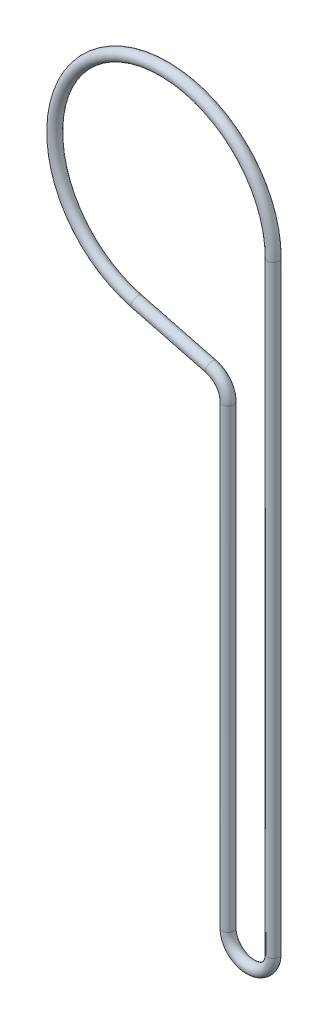
ISO-10303-21;
HEADER;
FILE_DESCRIPTION(('STEP AP214'),'2;1');
FILE_NAME('part.step','',(''),(''),'','','');
FILE_SCHEMA(('AUTOMOTIVE_DESIGN { 1 0 10303 214 1 1 1 1 }'));
ENDSEC;
DATA;
#1=APPLICATION_CONTEXT('core data for automotive mechanical design processes');
#2=APPLICATION_PROTOCOL_DEFINITION('international standard','automotive_design',2000,#1);
#3=PRODUCT_CONTEXT('',#1,'mechanical');
#4=PRODUCT('Part','Part','',(#3));
#5=PRODUCT_RELATED_PRODUCT_CATEGORY('part','',(#4));
#6=PRODUCT_DEFINITION_FORMATION('','',#4);
#7=PRODUCT_DEFINITION_CONTEXT('part definition',#1,'design');
#8=PRODUCT_DEFINITION('design','',#6,#7);
#9=PRODUCT_DEFINITION_SHAPE('','',#8);
#10=(LENGTH_UNIT() NAMED_UNIT(*) SI_UNIT(.MILLI.,.METRE.));
#11=(NAMED_UNIT(*) PLANE_ANGLE_UNIT() SI_UNIT($,.RADIAN.));
#12=(NAMED_UNIT(*) SI_UNIT($,.STERADIAN.) SOLID_ANGLE_UNIT());
#13=UNCERTAINTY_MEASURE_WITH_UNIT(LENGTH_MEASURE(1.E-05),#10,'distance_accuracy_value','');
#14=(GEOMETRIC_REPRESENTATION_CONTEXT(3) GLOBAL_UNCERTAINTY_ASSIGNED_CONTEXT((#13)) GLOBAL_UNIT_ASSIGNED_CONTEXT((#10,
#11,#12)) REPRESENTATION_CONTEXT('',''));
#15=CARTESIAN_POINT('',(0.,0.,0.));
#16=DIRECTION('',(0.,0.,1.));
#17=DIRECTION('',(1.,0.,0.));
#18=AXIS2_PLACEMENT_3D('',#15,#16,#17);
#19=CARTESIAN_POINT('',(23.,-160.,0.));
#20=DIRECTION('',(0.,0.,-1.));
#21=DIRECTION('',(-1.,0.,0.));
#22=AXIS2_PLACEMENT_3D('',#19,#20,#21);
#23=TOROIDAL_SURFACE('',#22,6.,1.5);
#24=CARTESIAN_POINT('',(29.,-160.,0.));
#25=DIRECTION('',(0.,1.,0.));
#26=DIRECTION('',(-1.,0.,0.));
#27=AXIS2_PLACEMENT_3D('',#24,#25,#26);
#28=CIRCLE('',#27,1.5);
#29=CARTESIAN_POINT('',(30.5,-160.,0.));
#30=VERTEX_POINT('',#29);
#31=EDGE_CURVE('E65',#30,#30,#28,.T.);
#32=CARTESIAN_POINT('',(17.,-160.,0.));
#33=DIRECTION('',(0.,-1.,0.));
#34=DIRECTION('',(1.,0.,0.));
#35=AXIS2_PLACEMENT_3D('',#32,#33,#34);
#36=CIRCLE('',#35,1.5);
#37=CARTESIAN_POINT('',(15.5,-160.,0.));
#38=VERTEX_POINT('',#37);
#39=EDGE_CURVE('E62',#38,#38,#36,.T.);
#40=CARTESIAN_POINT('',(23.,-160.,0.));
#41=DIRECTION('',(0.,0.,-1.));
#42=DIRECTION('',(-1.,0.,0.));
#43=AXIS2_PLACEMENT_3D('',#40,#41,#42);
#44=CIRCLE('',#43,7.5);
#45=EDGE_CURVE('',#30,#38,#44,.T.);
#46=ORIENTED_EDGE('',*,*,#31,.F.);
#47=ORIENTED_EDGE('',*,*,#39,.T.);
#48=ORIENTED_EDGE('',*,*,#45,.T.);
#49=ORIENTED_EDGE('',*,*,#45,.F.);
#50=EDGE_LOOP('',(#46,#48,#47,#49));
#51=FACE_BOUND('',#50,.T.);
#52=ADVANCED_FACE('F42',(#51),#23,.T.);
#53=CARTESIAN_POINT('',(17.,-160.,0.));
#54=DIRECTION('',(0.,1.,0.));
#55=DIRECTION('',(-1.,0.,0.));
#56=AXIS2_PLACEMENT_3D('',#53,#54,#55);
#57=CYLINDRICAL_SURFACE('',#56,1.5);
#58=CARTESIAN_POINT('',(17.,-39.,0.));
#59=DIRECTION('',(0.,-1.,0.));
#60=DIRECTION('',(1.,0.,0.));
#61=AXIS2_PLACEMENT_3D('',#58,#59,#60);
#62=CIRCLE('',#61,1.5);
#63=CARTESIAN_POINT('',(18.5,-39.,0.));
#64=VERTEX_POINT('',#63);
#65=EDGE_CURVE('E57',#64,#64,#62,.T.);
#66=ORIENTED_EDGE('',*,*,#65,.T.);
#67=EDGE_LOOP('',(#66));
#68=FACE_BOUND('',#67,.T.);
#69=ORIENTED_EDGE('',*,*,#39,.F.);
#70=EDGE_LOOP('',(#69));
#71=FACE_BOUND('',#70,.T.);
#72=ADVANCED_FACE('F72',(#68,#71),#57,.T.);
#73=CARTESIAN_POINT('',(11.,-39.,0.));
#74=DIRECTION('',(0.,0.,1.));
#75=DIRECTION('',(1.,0.,0.));
#76=AXIS2_PLACEMENT_3D('',#73,#74,#75);
#77=TOROIDAL_SURFACE('',#76,6.,1.5);
#78=CARTESIAN_POINT('',(12.5032979405962,-33.1913775039344,0.));
#79=DIRECTION('',(0.968103749344265,-0.250549656766033,0.));
#80=DIRECTION('',(0.250549656766033,0.968103749344265,0.));
#81=AXIS2_PLACEMENT_3D('',#78,#79,#80);
#82=CIRCLE('',#81,1.5);
#83=CARTESIAN_POINT('',(12.8791224257453,-31.739221879918,0.));
#84=VERTEX_POINT('',#83);
#85=EDGE_CURVE('E53',#84,#84,#82,.T.);
#86=CARTESIAN_POINT('',(11.,-39.,0.));
#87=DIRECTION('',(0.,0.,1.));
#88=DIRECTION('',(1.,0.,0.));
#89=AXIS2_PLACEMENT_3D('',#86,#87,#88);
#90=CIRCLE('',#89,7.5);
#91=EDGE_CURVE('',#64,#84,#90,.T.);
#92=ORIENTED_EDGE('',*,*,#65,.F.);
#93=ORIENTED_EDGE('',*,*,#85,.T.);
#94=ORIENTED_EDGE('',*,*,#91,.T.);
#95=ORIENTED_EDGE('',*,*,#91,.F.);
#96=EDGE_LOOP('',(#92,#94,#93,#95));
#97=FACE_BOUND('',#96,.T.);
#98=ADVANCED_FACE('F78',(#97),#77,.T.);
#99=CARTESIAN_POINT('',(12.5032979405962,-33.1913775039344,0.));
#100=DIRECTION('',(-0.968103749344265,0.250549656766031,0.));
#101=DIRECTION('',(-0.250549656766031,-0.968103749344265,0.));
#102=AXIS2_PLACEMENT_3D('',#99,#100,#101);
#103=CYLINDRICAL_SURFACE('',#102,1.5);
#104=CARTESIAN_POINT('',(-7.26594004621489,-28.0750087309837,0.));
#105=DIRECTION('',(0.968103749344265,-0.250549656766033,0.));
#106=DIRECTION('',(0.250549656766033,0.968103749344265,0.));
#107=AXIS2_PLACEMENT_3D('',#104,#105,#106);
#108=CIRCLE('',#107,1.5);
#109=CARTESIAN_POINT('',(-7.64176453136394,-29.5271643550001,0.));
#110=VERTEX_POINT('',#109);
#111=EDGE_CURVE('E49',#110,#110,#108,.T.);
#112=ORIENTED_EDGE('',*,*,#111,.T.);
#113=EDGE_LOOP('',(#112));
#114=FACE_BOUND('',#113,.T.);
#115=ORIENTED_EDGE('',*,*,#85,.F.);
#116=EDGE_LOOP('',(#115));
#117=FACE_BOUND('',#116,.T.);
#118=ADVANCED_FACE('F84',(#114,#117),#103,.T.);
#119=CARTESIAN_POINT('',(0.,0.,0.));
#120=DIRECTION('',(0.,0.,-1.));
#121=DIRECTION('',(-1.,0.,0.));
#122=AXIS2_PLACEMENT_3D('',#119,#120,#121);
#123=TOROIDAL_SURFACE('',#122,29.,1.5);
#124=CARTESIAN_POINT('',(29.,0.,0.));
#125=DIRECTION('',(0.,1.,0.));
#126=DIRECTION('',(-1.,0.,0.));
#127=AXIS2_PLACEMENT_3D('',#124,#125,#126);
#128=CIRCLE('',#127,1.5);
#129=CARTESIAN_POINT('',(30.5,0.,0.));
#130=VERTEX_POINT('',#129);
#131=EDGE_CURVE('E11',#130,#130,#128,.T.);
#132=CARTESIAN_POINT('',(0.,0.,0.));
#133=DIRECTION('',(0.,0.,-1.));
#134=DIRECTION('',(-1.,0.,0.));
#135=AXIS2_PLACEMENT_3D('',#132,#133,#134);
#136=CIRCLE('',#135,30.5);
#137=EDGE_CURVE('',#110,#130,#136,.T.);
#138=ORIENTED_EDGE('',*,*,#111,.F.);
#139=ORIENTED_EDGE('',*,*,#131,.T.);
#140=ORIENTED_EDGE('',*,*,#137,.T.);
#141=ORIENTED_EDGE('',*,*,#137,.F.);
#142=EDGE_LOOP('',(#138,#140,#139,#141));
#143=FACE_BOUND('',#142,.T.);
#144=ADVANCED_FACE('F87',(#143),#123,.T.);
#145=CARTESIAN_POINT('',(29.,0.,0.));
#146=DIRECTION('',(0.,-1.,0.));
#147=DIRECTION('',(1.,0.,0.));
#148=AXIS2_PLACEMENT_3D('',#145,#146,#147);
#149=CYLINDRICAL_SURFACE('',#148,1.5);
#150=ORIENTED_EDGE('',*,*,#31,.T.);
#151=EDGE_LOOP('',(#150));
#152=FACE_BOUND('',#151,.T.);
#153=ORIENTED_EDGE('',*,*,#131,.F.);
#154=EDGE_LOOP('',(#153));
#155=FACE_BOUND('',#154,.T.);
#156=ADVANCED_FACE('F44',(#152,#155),#149,.T.);
#157=CLOSED_SHELL('',(#52,#72,#98,#118,#144,#156));
#158=MANIFOLD_SOLID_BREP('B2',#157);
#159=ADVANCED_BREP_SHAPE_REPRESENTATION('',(#18,#158),#14);
#160=SHAPE_DEFINITION_REPRESENTATION(#9,#159);
ENDSEC;
END-ISO-10303-21;
